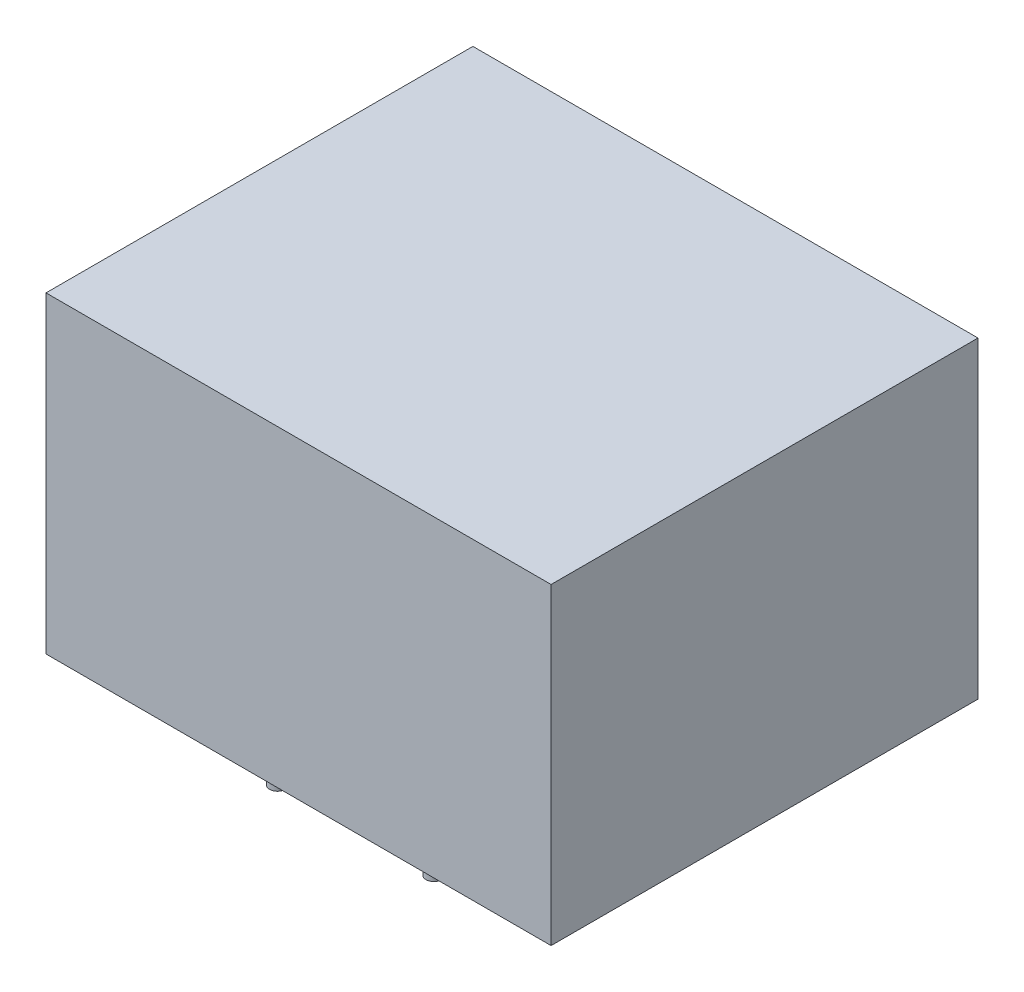
ISO-10303-21;
HEADER;
FILE_DESCRIPTION(('STEP AP214'),'2;1');
FILE_NAME('part.step','',(''),(''),'','','');
FILE_SCHEMA(('AUTOMOTIVE_DESIGN { 1 0 10303 214 1 1 1 1 }'));
ENDSEC;
DATA;
#1=APPLICATION_CONTEXT('core data for automotive mechanical design processes');
#2=APPLICATION_PROTOCOL_DEFINITION('international standard','automotive_design',2000,#1);
#3=PRODUCT_CONTEXT('',#1,'mechanical');
#4=PRODUCT('Part','Part','',(#3));
#5=PRODUCT_RELATED_PRODUCT_CATEGORY('part','',(#4));
#6=PRODUCT_DEFINITION_FORMATION('','',#4);
#7=PRODUCT_DEFINITION_CONTEXT('part definition',#1,'design');
#8=PRODUCT_DEFINITION('design','',#6,#7);
#9=PRODUCT_DEFINITION_SHAPE('','',#8);
#10=(LENGTH_UNIT() NAMED_UNIT(*) SI_UNIT(.MILLI.,.METRE.));
#11=(NAMED_UNIT(*) PLANE_ANGLE_UNIT() SI_UNIT($,.RADIAN.));
#12=(NAMED_UNIT(*) SI_UNIT($,.STERADIAN.) SOLID_ANGLE_UNIT());
#13=UNCERTAINTY_MEASURE_WITH_UNIT(LENGTH_MEASURE(1.E-05),#10,'distance_accuracy_value','');
#14=(GEOMETRIC_REPRESENTATION_CONTEXT(3) GLOBAL_UNCERTAINTY_ASSIGNED_CONTEXT((#13)) GLOBAL_UNIT_ASSIGNED_CONTEXT((#10,
#11,#12)) REPRESENTATION_CONTEXT('',''));
#15=CARTESIAN_POINT('',(0.,0.,0.));
#16=DIRECTION('',(0.,0.,1.));
#17=DIRECTION('',(1.,0.,0.));
#18=AXIS2_PLACEMENT_3D('',#15,#16,#17);
#19=CARTESIAN_POINT('',(0.,0.,0.));
#20=DIRECTION('',(0.,1.,0.));
#21=DIRECTION('',(0.,0.,1.));
#22=AXIS2_PLACEMENT_3D('',#19,#20,#21);
#23=PLANE('',#22);
#24=CARTESIAN_POINT('',(-10.,0.,-10.));
#25=DIRECTION('',(0.,1.,0.));
#26=DIRECTION('',(0.,0.,1.));
#27=AXIS2_PLACEMENT_3D('',#24,#25,#26);
#28=CIRCLE('',#27,0.500000000000001);
#29=CARTESIAN_POINT('',(-10.,0.,-9.5));
#30=VERTEX_POINT('',#29);
#31=EDGE_CURVE('E43',#30,#30,#28,.F.);
#32=ORIENTED_EDGE('',*,*,#31,.F.);
#33=EDGE_LOOP('',(#32));
#34=FACE_BOUND('',#33,.T.);
#35=CARTESIAN_POINT('',(-5.,0.,10.));
#36=DIRECTION('',(0.,1.,0.));
#37=DIRECTION('',(0.,0.,1.));
#38=AXIS2_PLACEMENT_3D('',#35,#36,#37);
#39=CIRCLE('',#38,0.500000000000002);
#40=CARTESIAN_POINT('',(-5.,0.,10.5));
#41=VERTEX_POINT('',#40);
#42=EDGE_CURVE('E112',#41,#41,#39,.F.);
#43=ORIENTED_EDGE('',*,*,#42,.F.);
#44=EDGE_LOOP('',(#43));
#45=FACE_BOUND('',#44,.T.);
#46=DIRECTION('',(0.,0.,1.));
#47=VECTOR('',#46,1.);
#48=CARTESIAN_POINT('',(-16.15,0.,13.65));
#49=LINE('',#48,#47);
#50=CARTESIAN_POINT('',(-16.15,0.,-13.65));
#51=VERTEX_POINT('',#50);
#52=CARTESIAN_POINT('',(-16.15,0.,13.65));
#53=VERTEX_POINT('',#52);
#54=EDGE_CURVE('E102',#51,#53,#49,.T.);
#55=ORIENTED_EDGE('',*,*,#54,.F.);
#56=DIRECTION('',(-1.,0.,0.));
#57=VECTOR('',#56,1.);
#58=CARTESIAN_POINT('',(16.15,0.,-13.65));
#59=LINE('',#58,#57);
#60=CARTESIAN_POINT('',(16.15,0.,-13.65));
#61=VERTEX_POINT('',#60);
#62=EDGE_CURVE('E74',#61,#51,#59,.T.);
#63=ORIENTED_EDGE('',*,*,#62,.F.);
#64=DIRECTION('',(0.,0.,-1.));
#65=VECTOR('',#64,1.);
#66=CARTESIAN_POINT('',(16.15,0.,13.65));
#67=LINE('',#66,#65);
#68=CARTESIAN_POINT('',(16.15,0.,13.65));
#69=VERTEX_POINT('',#68);
#70=EDGE_CURVE('E68',#69,#61,#67,.T.);
#71=ORIENTED_EDGE('',*,*,#70,.F.);
#72=DIRECTION('',(1.,0.,0.));
#73=VECTOR('',#72,1.);
#74=CARTESIAN_POINT('',(16.15,0.,13.65));
#75=LINE('',#74,#73);
#76=EDGE_CURVE('E92',#53,#69,#75,.T.);
#77=ORIENTED_EDGE('',*,*,#76,.F.);
#78=EDGE_LOOP('',(#55,#63,#71,#77));
#79=FACE_BOUND('',#78,.T.);
#80=CARTESIAN_POINT('',(5.,0.,10.));
#81=DIRECTION('',(0.,1.,0.));
#82=DIRECTION('',(0.,0.,1.));
#83=AXIS2_PLACEMENT_3D('',#80,#81,#82);
#84=CIRCLE('',#83,0.500000000000002);
#85=CARTESIAN_POINT('',(5.,0.,10.5));
#86=VERTEX_POINT('',#85);
#87=EDGE_CURVE('E115',#86,#86,#84,.F.);
#88=ORIENTED_EDGE('',*,*,#87,.F.);
#89=EDGE_LOOP('',(#88));
#90=FACE_BOUND('',#89,.T.);
#91=CARTESIAN_POINT('',(10.,0.,-10.));
#92=DIRECTION('',(0.,1.,0.));
#93=DIRECTION('',(0.,0.,1.));
#94=AXIS2_PLACEMENT_3D('',#91,#92,#93);
#95=CIRCLE('',#94,0.500000000000001);
#96=CARTESIAN_POINT('',(10.,0.,-9.5));
#97=VERTEX_POINT('',#96);
#98=EDGE_CURVE('E11',#97,#97,#95,.F.);
#99=ORIENTED_EDGE('',*,*,#98,.F.);
#100=EDGE_LOOP('',(#99));
#101=FACE_BOUND('',#100,.T.);
#102=ADVANCED_FACE('F34',(#34,#45,#79,#90,#101),#23,.F.);
#103=CARTESIAN_POINT('',(-16.15,20.,13.65));
#104=DIRECTION('',(1.,0.,0.));
#105=DIRECTION('',(0.,0.,-1.));
#106=AXIS2_PLACEMENT_3D('',#103,#104,#105);
#107=PLANE('',#106);
#108=ORIENTED_EDGE('',*,*,#54,.T.);
#109=DIRECTION('',(0.,-1.,0.));
#110=VECTOR('',#109,1.);
#111=CARTESIAN_POINT('',(-16.15,20.,13.65));
#112=LINE('',#111,#110);
#113=CARTESIAN_POINT('',(-16.15,20.,13.65));
#114=VERTEX_POINT('',#113);
#115=EDGE_CURVE('E93',#114,#53,#112,.T.);
#116=ORIENTED_EDGE('',*,*,#115,.F.);
#117=DIRECTION('',(0.,0.,1.));
#118=VECTOR('',#117,1.);
#119=CARTESIAN_POINT('',(-16.15,20.,13.65));
#120=LINE('',#119,#118);
#121=CARTESIAN_POINT('',(-16.15,20.,-13.65));
#122=VERTEX_POINT('',#121);
#123=EDGE_CURVE('E87',#122,#114,#120,.T.);
#124=ORIENTED_EDGE('',*,*,#123,.F.);
#125=DIRECTION('',(0.,-1.,0.));
#126=VECTOR('',#125,1.);
#127=CARTESIAN_POINT('',(-16.15,20.,-13.65));
#128=LINE('',#127,#126);
#129=EDGE_CURVE('E98',#122,#51,#128,.T.);
#130=ORIENTED_EDGE('',*,*,#129,.T.);
#131=EDGE_LOOP('',(#108,#116,#124,#130));
#132=FACE_BOUND('',#131,.T.);
#133=ADVANCED_FACE('F36',(#132),#107,.F.);
#134=CARTESIAN_POINT('',(16.15,20.,13.65));
#135=DIRECTION('',(0.,0.,-1.));
#136=DIRECTION('',(-1.,0.,0.));
#137=AXIS2_PLACEMENT_3D('',#134,#135,#136);
#138=PLANE('',#137);
#139=ORIENTED_EDGE('',*,*,#76,.T.);
#140=DIRECTION('',(0.,-1.,0.));
#141=VECTOR('',#140,1.);
#142=CARTESIAN_POINT('',(16.15,20.,13.65));
#143=LINE('',#142,#141);
#144=CARTESIAN_POINT('',(16.15,20.,13.65));
#145=VERTEX_POINT('',#144);
#146=EDGE_CURVE('E90',#145,#69,#143,.T.);
#147=ORIENTED_EDGE('',*,*,#146,.F.);
#148=DIRECTION('',(1.,0.,0.));
#149=VECTOR('',#148,1.);
#150=CARTESIAN_POINT('',(16.15,20.,13.65));
#151=LINE('',#150,#149);
#152=EDGE_CURVE('E82',#114,#145,#151,.T.);
#153=ORIENTED_EDGE('',*,*,#152,.F.);
#154=ORIENTED_EDGE('',*,*,#115,.T.);
#155=EDGE_LOOP('',(#139,#147,#153,#154));
#156=FACE_BOUND('',#155,.T.);
#157=ADVANCED_FACE('F91',(#156),#138,.F.);
#158=CARTESIAN_POINT('',(16.15,20.,13.65));
#159=DIRECTION('',(-1.,0.,0.));
#160=DIRECTION('',(0.,0.,1.));
#161=AXIS2_PLACEMENT_3D('',#158,#159,#160);
#162=PLANE('',#161);
#163=ORIENTED_EDGE('',*,*,#70,.T.);
#164=DIRECTION('',(0.,-1.,0.));
#165=VECTOR('',#164,1.);
#166=CARTESIAN_POINT('',(16.15,20.,-13.65));
#167=LINE('',#166,#165);
#168=CARTESIAN_POINT('',(16.15,20.,-13.65));
#169=VERTEX_POINT('',#168);
#170=EDGE_CURVE('E94',#169,#61,#167,.T.);
#171=ORIENTED_EDGE('',*,*,#170,.F.);
#172=DIRECTION('',(0.,0.,-1.));
#173=VECTOR('',#172,1.);
#174=CARTESIAN_POINT('',(16.15,20.,13.65));
#175=LINE('',#174,#173);
#176=EDGE_CURVE('E85',#145,#169,#175,.T.);
#177=ORIENTED_EDGE('',*,*,#176,.F.);
#178=ORIENTED_EDGE('',*,*,#146,.T.);
#179=EDGE_LOOP('',(#163,#171,#177,#178));
#180=FACE_BOUND('',#179,.T.);
#181=ADVANCED_FACE('F96',(#180),#162,.F.);
#182=CARTESIAN_POINT('',(16.15,20.,-13.65));
#183=DIRECTION('',(0.,0.,1.));
#184=DIRECTION('',(1.,0.,0.));
#185=AXIS2_PLACEMENT_3D('',#182,#183,#184);
#186=PLANE('',#185);
#187=ORIENTED_EDGE('',*,*,#62,.T.);
#188=ORIENTED_EDGE('',*,*,#129,.F.);
#189=DIRECTION('',(-1.,0.,0.));
#190=VECTOR('',#189,1.);
#191=CARTESIAN_POINT('',(16.15,20.,-13.65));
#192=LINE('',#191,#190);
#193=EDGE_CURVE('E51',#169,#122,#192,.T.);
#194=ORIENTED_EDGE('',*,*,#193,.F.);
#195=ORIENTED_EDGE('',*,*,#170,.T.);
#196=EDGE_LOOP('',(#187,#188,#194,#195));
#197=FACE_BOUND('',#196,.T.);
#198=ADVANCED_FACE('F169',(#197),#186,.F.);
#199=CARTESIAN_POINT('',(0.,20.,0.));
#200=DIRECTION('',(0.,1.,0.));
#201=DIRECTION('',(0.,0.,1.));
#202=AXIS2_PLACEMENT_3D('',#199,#200,#201);
#203=PLANE('',#202);
#204=ORIENTED_EDGE('',*,*,#123,.T.);
#205=ORIENTED_EDGE('',*,*,#152,.T.);
#206=ORIENTED_EDGE('',*,*,#176,.T.);
#207=ORIENTED_EDGE('',*,*,#193,.T.);
#208=EDGE_LOOP('',(#204,#205,#206,#207));
#209=FACE_BOUND('',#208,.T.);
#210=ADVANCED_FACE('F83',(#209),#203,.T.);
#211=CARTESIAN_POINT('',(-5.,-3.5,10.));
#212=DIRECTION('',(0.,1.,0.));
#213=DIRECTION('',(0.,0.,1.));
#214=AXIS2_PLACEMENT_3D('',#211,#212,#213);
#215=CYLINDRICAL_SURFACE('',#214,0.500000000000002);
#216=CARTESIAN_POINT('',(-5.,-3.5,10.));
#217=DIRECTION('',(0.,-1.,0.));
#218=DIRECTION('',(0.,0.,-1.));
#219=AXIS2_PLACEMENT_3D('',#216,#217,#218);
#220=CIRCLE('',#219,0.500000000000002);
#221=CARTESIAN_POINT('',(-5.,-3.5,9.5));
#222=VERTEX_POINT('',#221);
#223=EDGE_CURVE('E105',#222,#222,#220,.T.);
#224=ORIENTED_EDGE('',*,*,#223,.F.);
#225=EDGE_LOOP('',(#224));
#226=FACE_BOUND('',#225,.T.);
#227=ORIENTED_EDGE('',*,*,#42,.T.);
#228=EDGE_LOOP('',(#227));
#229=FACE_BOUND('',#228,.T.);
#230=ADVANCED_FACE('F163',(#226,#229),#215,.T.);
#231=CARTESIAN_POINT('',(-5.,-3.5,10.));
#232=DIRECTION('',(0.,-1.,0.));
#233=DIRECTION('',(0.,0.,-1.));
#234=AXIS2_PLACEMENT_3D('',#231,#232,#233);
#235=PLANE('',#234);
#236=ORIENTED_EDGE('',*,*,#223,.T.);
#237=EDGE_LOOP('',(#236));
#238=FACE_BOUND('',#237,.T.);
#239=ADVANCED_FACE('F159',(#238),#235,.T.);
#240=CARTESIAN_POINT('',(5.,-3.5,10.));
#241=DIRECTION('',(0.,1.,0.));
#242=DIRECTION('',(0.,0.,1.));
#243=AXIS2_PLACEMENT_3D('',#240,#241,#242);
#244=CYLINDRICAL_SURFACE('',#243,0.500000000000002);
#245=CARTESIAN_POINT('',(5.,-3.5,10.));
#246=DIRECTION('',(0.,-1.,0.));
#247=DIRECTION('',(0.,0.,-1.));
#248=AXIS2_PLACEMENT_3D('',#245,#246,#247);
#249=CIRCLE('',#248,0.500000000000002);
#250=CARTESIAN_POINT('',(5.,-3.5,9.5));
#251=VERTEX_POINT('',#250);
#252=EDGE_CURVE('E184',#251,#251,#249,.T.);
#253=ORIENTED_EDGE('',*,*,#252,.F.);
#254=EDGE_LOOP('',(#253));
#255=FACE_BOUND('',#254,.T.);
#256=ORIENTED_EDGE('',*,*,#87,.T.);
#257=EDGE_LOOP('',(#256));
#258=FACE_BOUND('',#257,.T.);
#259=ADVANCED_FACE('F155',(#255,#258),#244,.T.);
#260=CARTESIAN_POINT('',(5.,-3.5,10.));
#261=DIRECTION('',(0.,-1.,0.));
#262=DIRECTION('',(0.,0.,-1.));
#263=AXIS2_PLACEMENT_3D('',#260,#261,#262);
#264=PLANE('',#263);
#265=ORIENTED_EDGE('',*,*,#252,.T.);
#266=EDGE_LOOP('',(#265));
#267=FACE_BOUND('',#266,.T.);
#268=ADVANCED_FACE('F151',(#267),#264,.T.);
#269=CARTESIAN_POINT('',(-10.,-3.5,-10.));
#270=DIRECTION('',(0.,1.,0.));
#271=DIRECTION('',(0.,0.,1.));
#272=AXIS2_PLACEMENT_3D('',#269,#270,#271);
#273=CYLINDRICAL_SURFACE('',#272,0.500000000000001);
#274=CARTESIAN_POINT('',(-10.,-3.5,-10.));
#275=DIRECTION('',(0.,-1.,0.));
#276=DIRECTION('',(0.,0.,-1.));
#277=AXIS2_PLACEMENT_3D('',#274,#275,#276);
#278=CIRCLE('',#277,0.500000000000001);
#279=CARTESIAN_POINT('',(-10.,-3.5,-10.5));
#280=VERTEX_POINT('',#279);
#281=EDGE_CURVE('E187',#280,#280,#278,.T.);
#282=ORIENTED_EDGE('',*,*,#281,.F.);
#283=EDGE_LOOP('',(#282));
#284=FACE_BOUND('',#283,.T.);
#285=ORIENTED_EDGE('',*,*,#31,.T.);
#286=EDGE_LOOP('',(#285));
#287=FACE_BOUND('',#286,.T.);
#288=ADVANCED_FACE('F120',(#284,#287),#273,.T.);
#289=CARTESIAN_POINT('',(-10.,-3.5,-10.));
#290=DIRECTION('',(0.,-1.,0.));
#291=DIRECTION('',(0.,0.,-1.));
#292=AXIS2_PLACEMENT_3D('',#289,#290,#291);
#293=PLANE('',#292);
#294=ORIENTED_EDGE('',*,*,#281,.T.);
#295=EDGE_LOOP('',(#294));
#296=FACE_BOUND('',#295,.T.);
#297=ADVANCED_FACE('F136',(#296),#293,.T.);
#298=CARTESIAN_POINT('',(10.,-3.5,-10.));
#299=DIRECTION('',(0.,1.,0.));
#300=DIRECTION('',(0.,0.,1.));
#301=AXIS2_PLACEMENT_3D('',#298,#299,#300);
#302=CYLINDRICAL_SURFACE('',#301,0.500000000000001);
#303=CARTESIAN_POINT('',(10.,-3.5,-10.));
#304=DIRECTION('',(0.,-1.,0.));
#305=DIRECTION('',(0.,0.,-1.));
#306=AXIS2_PLACEMENT_3D('',#303,#304,#305);
#307=CIRCLE('',#306,0.500000000000001);
#308=CARTESIAN_POINT('',(10.,-3.5,-10.5));
#309=VERTEX_POINT('',#308);
#310=EDGE_CURVE('E190',#309,#309,#307,.T.);
#311=ORIENTED_EDGE('',*,*,#310,.F.);
#312=EDGE_LOOP('',(#311));
#313=FACE_BOUND('',#312,.T.);
#314=ORIENTED_EDGE('',*,*,#98,.T.);
#315=EDGE_LOOP('',(#314));
#316=FACE_BOUND('',#315,.T.);
#317=ADVANCED_FACE('F133',(#313,#316),#302,.T.);
#318=CARTESIAN_POINT('',(10.,-3.5,-10.));
#319=DIRECTION('',(0.,-1.,0.));
#320=DIRECTION('',(0.,0.,-1.));
#321=AXIS2_PLACEMENT_3D('',#318,#319,#320);
#322=PLANE('',#321);
#323=ORIENTED_EDGE('',*,*,#310,.T.);
#324=EDGE_LOOP('',(#323));
#325=FACE_BOUND('',#324,.T.);
#326=ADVANCED_FACE('F135',(#325),#322,.T.);
#327=CLOSED_SHELL('',(#102,#133,#157,#181,#198,#210,#230,#239,#259,#268,#288,#297,#317,#326));
#328=MANIFOLD_SOLID_BREP('B2',#327);
#329=ADVANCED_BREP_SHAPE_REPRESENTATION('',(#18,#328),#14);
#330=SHAPE_DEFINITION_REPRESENTATION(#9,#329);
ENDSEC;
END-ISO-10303-21;
